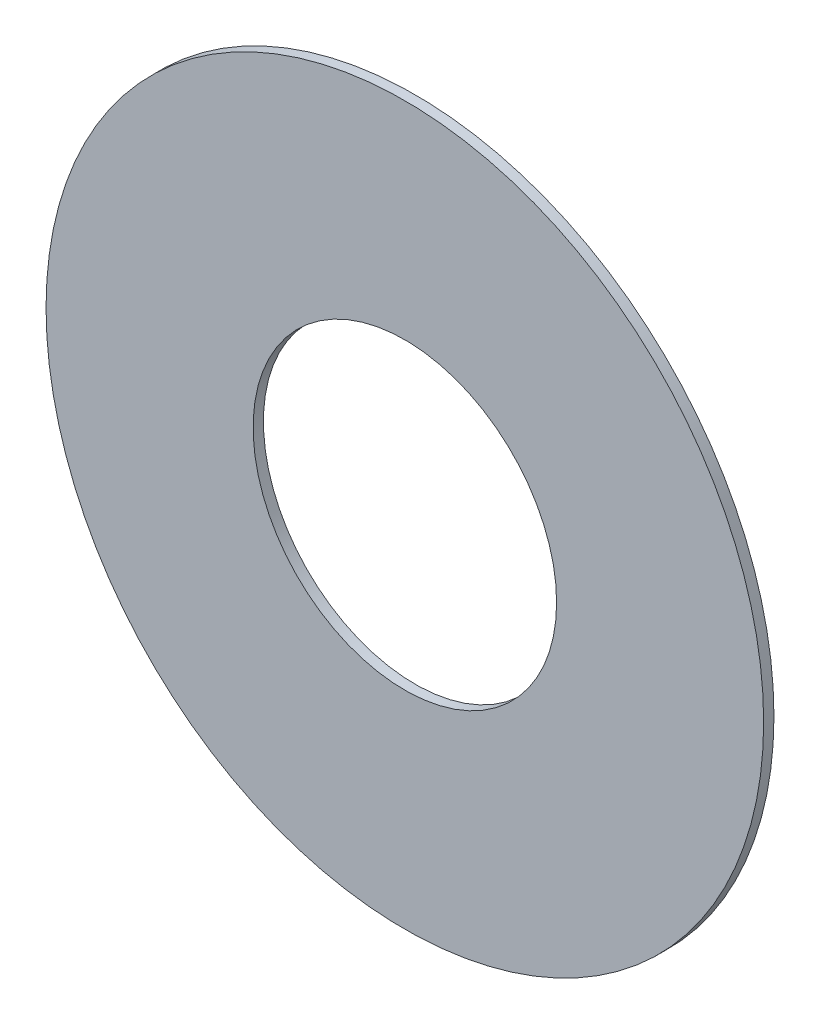
ISO-10303-21;
HEADER;
FILE_DESCRIPTION(('STEP AP214'),'2;1');
FILE_NAME('part.step','',(''),(''),'','','');
FILE_SCHEMA(('AUTOMOTIVE_DESIGN { 1 0 10303 214 1 1 1 1 }'));
ENDSEC;
DATA;
#1=APPLICATION_CONTEXT('core data for automotive mechanical design processes');
#2=APPLICATION_PROTOCOL_DEFINITION('international standard','automotive_design',2000,#1);
#3=PRODUCT_CONTEXT('',#1,'mechanical');
#4=PRODUCT('Part','Part','',(#3));
#5=PRODUCT_RELATED_PRODUCT_CATEGORY('part','',(#4));
#6=PRODUCT_DEFINITION_FORMATION('','',#4);
#7=PRODUCT_DEFINITION_CONTEXT('part definition',#1,'design');
#8=PRODUCT_DEFINITION('design','',#6,#7);
#9=PRODUCT_DEFINITION_SHAPE('','',#8);
#10=(LENGTH_UNIT() NAMED_UNIT(*) SI_UNIT(.MILLI.,.METRE.));
#11=(NAMED_UNIT(*) PLANE_ANGLE_UNIT() SI_UNIT($,.RADIAN.));
#12=(NAMED_UNIT(*) SI_UNIT($,.STERADIAN.) SOLID_ANGLE_UNIT());
#13=UNCERTAINTY_MEASURE_WITH_UNIT(LENGTH_MEASURE(1.E-05),#10,'distance_accuracy_value','');
#14=(GEOMETRIC_REPRESENTATION_CONTEXT(3) GLOBAL_UNCERTAINTY_ASSIGNED_CONTEXT((#13)) GLOBAL_UNIT_ASSIGNED_CONTEXT((#10,
#11,#12)) REPRESENTATION_CONTEXT('',''));
#15=CARTESIAN_POINT('',(0.,0.,0.));
#16=DIRECTION('',(0.,0.,1.));
#17=DIRECTION('',(1.,0.,0.));
#18=AXIS2_PLACEMENT_3D('',#15,#16,#17);
#19=CARTESIAN_POINT('',(0.,0.,42.5));
#20=DIRECTION('',(0.,0.,1.));
#21=DIRECTION('',(1.,0.,0.));
#22=AXIS2_PLACEMENT_3D('',#19,#20,#21);
#23=PLANE('',#22);
#24=CARTESIAN_POINT('',(0.,0.,42.5));
#25=DIRECTION('',(0.,0.,1.));
#26=DIRECTION('',(1.,0.,0.));
#27=AXIS2_PLACEMENT_3D('',#24,#25,#26);
#28=CIRCLE('',#27,69.7538461538462);
#29=CARTESIAN_POINT('',(69.7538461538462,0.,42.5));
#30=VERTEX_POINT('',#29);
#31=EDGE_CURVE('E10',#30,#30,#28,.T.);
#32=ORIENTED_EDGE('',*,*,#31,.T.);
#33=EDGE_LOOP('',(#32));
#34=FACE_BOUND('',#33,.T.);
#35=CARTESIAN_POINT('',(0.,0.,42.5));
#36=DIRECTION('',(0.,0.,1.));
#37=DIRECTION('',(1.,0.,0.));
#38=AXIS2_PLACEMENT_3D('',#35,#36,#37);
#39=CIRCLE('',#38,29.5);
#40=CARTESIAN_POINT('',(29.5,0.,42.5));
#41=VERTEX_POINT('',#40);
#42=EDGE_CURVE('E46',#41,#41,#39,.T.);
#43=ORIENTED_EDGE('',*,*,#42,.F.);
#44=EDGE_LOOP('',(#43));
#45=FACE_BOUND('',#44,.T.);
#46=ADVANCED_FACE('F35',(#34,#45),#23,.T.);
#47=CARTESIAN_POINT('',(0.,0.,40.5));
#48=DIRECTION('',(0.,0.,1.));
#49=DIRECTION('',(1.,0.,0.));
#50=AXIS2_PLACEMENT_3D('',#47,#48,#49);
#51=PLANE('',#50);
#52=CARTESIAN_POINT('',(0.,0.,40.5));
#53=DIRECTION('',(0.,0.,1.));
#54=DIRECTION('',(1.,0.,0.));
#55=AXIS2_PLACEMENT_3D('',#52,#53,#54);
#56=CIRCLE('',#55,69.7538461538462);
#57=CARTESIAN_POINT('',(69.7538461538462,0.,40.5));
#58=VERTEX_POINT('',#57);
#59=EDGE_CURVE('E39',#58,#58,#56,.T.);
#60=ORIENTED_EDGE('',*,*,#59,.F.);
#61=EDGE_LOOP('',(#60));
#62=FACE_BOUND('',#61,.T.);
#63=CARTESIAN_POINT('',(0.,0.,40.5));
#64=DIRECTION('',(0.,0.,1.));
#65=DIRECTION('',(1.,0.,0.));
#66=AXIS2_PLACEMENT_3D('',#63,#64,#65);
#67=CIRCLE('',#66,29.5);
#68=CARTESIAN_POINT('',(29.5,0.,40.5));
#69=VERTEX_POINT('',#68);
#70=EDGE_CURVE('E48',#69,#69,#67,.T.);
#71=ORIENTED_EDGE('',*,*,#70,.T.);
#72=EDGE_LOOP('',(#71));
#73=FACE_BOUND('',#72,.T.);
#74=ADVANCED_FACE('F58',(#62,#73),#51,.F.);
#75=CARTESIAN_POINT('',(0.,0.,42.5));
#76=DIRECTION('',(0.,0.,-1.));
#77=DIRECTION('',(-1.,0.,0.));
#78=AXIS2_PLACEMENT_3D('',#75,#76,#77);
#79=CYLINDRICAL_SURFACE('',#78,69.7538461538462);
#80=ORIENTED_EDGE('',*,*,#31,.F.);
#81=EDGE_LOOP('',(#80));
#82=FACE_BOUND('',#81,.T.);
#83=ORIENTED_EDGE('',*,*,#59,.T.);
#84=EDGE_LOOP('',(#83));
#85=FACE_BOUND('',#84,.T.);
#86=ADVANCED_FACE('F37',(#82,#85),#79,.T.);
#87=CARTESIAN_POINT('',(0.,0.,42.5));
#88=DIRECTION('',(0.,0.,-1.));
#89=DIRECTION('',(-1.,0.,0.));
#90=AXIS2_PLACEMENT_3D('',#87,#88,#89);
#91=CYLINDRICAL_SURFACE('',#90,29.5);
#92=ORIENTED_EDGE('',*,*,#42,.T.);
#93=EDGE_LOOP('',(#92));
#94=FACE_BOUND('',#93,.T.);
#95=ORIENTED_EDGE('',*,*,#70,.F.);
#96=EDGE_LOOP('',(#95));
#97=FACE_BOUND('',#96,.T.);
#98=ADVANCED_FACE('F54',(#94,#97),#91,.F.);
#99=CLOSED_SHELL('',(#46,#74,#86,#98));
#100=MANIFOLD_SOLID_BREP('B2',#99);
#101=ADVANCED_BREP_SHAPE_REPRESENTATION('',(#18,#100),#14);
#102=SHAPE_DEFINITION_REPRESENTATION(#9,#101);
ENDSEC;
END-ISO-10303-21;
